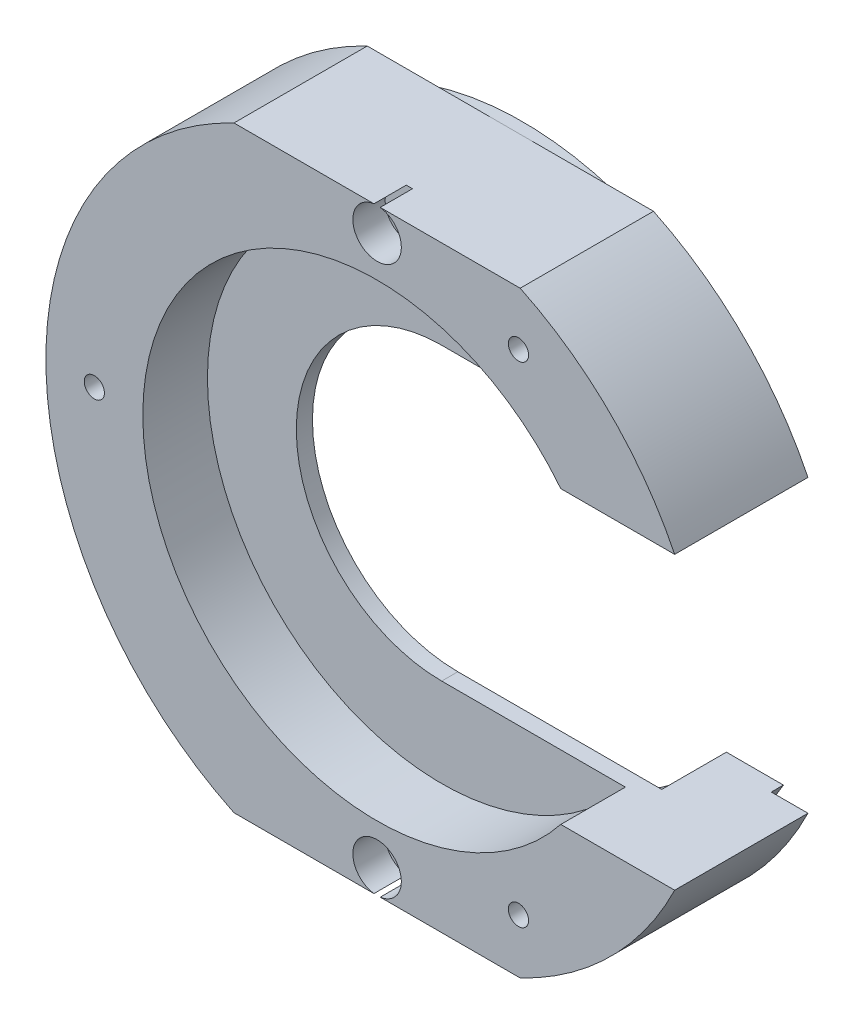
ISO-10303-21;
HEADER;
FILE_DESCRIPTION(('STEP AP214'),'2;1');
FILE_NAME('part.step','',(''),(''),'','','');
FILE_SCHEMA(('AUTOMOTIVE_DESIGN { 1 0 10303 214 1 1 1 1 }'));
ENDSEC;
DATA;
#1=APPLICATION_CONTEXT('core data for automotive mechanical design processes');
#2=APPLICATION_PROTOCOL_DEFINITION('international standard','automotive_design',2000,#1);
#3=PRODUCT_CONTEXT('',#1,'mechanical');
#4=PRODUCT('Part','Part','',(#3));
#5=PRODUCT_RELATED_PRODUCT_CATEGORY('part','',(#4));
#6=PRODUCT_DEFINITION_FORMATION('','',#4);
#7=PRODUCT_DEFINITION_CONTEXT('part definition',#1,'design');
#8=PRODUCT_DEFINITION('design','',#6,#7);
#9=PRODUCT_DEFINITION_SHAPE('','',#8);
#10=(LENGTH_UNIT() NAMED_UNIT(*) SI_UNIT(.MILLI.,.METRE.));
#11=(NAMED_UNIT(*) PLANE_ANGLE_UNIT() SI_UNIT($,.RADIAN.));
#12=(NAMED_UNIT(*) SI_UNIT($,.STERADIAN.) SOLID_ANGLE_UNIT());
#13=UNCERTAINTY_MEASURE_WITH_UNIT(LENGTH_MEASURE(1.E-05),#10,'distance_accuracy_value','');
#14=(GEOMETRIC_REPRESENTATION_CONTEXT(3) GLOBAL_UNCERTAINTY_ASSIGNED_CONTEXT((#13)) GLOBAL_UNIT_ASSIGNED_CONTEXT((#10,
#11,#12)) REPRESENTATION_CONTEXT('',''));
#15=CARTESIAN_POINT('',(0.,0.,0.));
#16=DIRECTION('',(0.,0.,1.));
#17=DIRECTION('',(1.,0.,0.));
#18=AXIS2_PLACEMENT_3D('',#15,#16,#17);
#19=CARTESIAN_POINT('',(0.,0.,-1.5));
#20=DIRECTION('',(0.,0.,-1.));
#21=DIRECTION('',(-1.,0.,0.));
#22=AXIS2_PLACEMENT_3D('',#19,#20,#21);
#23=PLANE('',#22);
#24=CARTESIAN_POINT('',(17.5000000000001,-30.3108891324553,-1.5));
#25=DIRECTION('',(0.,0.,1.));
#26=DIRECTION('',(1.,0.,0.));
#27=AXIS2_PLACEMENT_3D('',#24,#25,#26);
#28=CIRCLE('',#27,1.25);
#29=CARTESIAN_POINT('',(18.7500000000001,-30.3108891324553,-1.5));
#30=VERTEX_POINT('',#29);
#31=EDGE_CURVE('E336',#30,#30,#28,.T.);
#32=ORIENTED_EDGE('',*,*,#31,.T.);
#33=EDGE_LOOP('',(#32));
#34=FACE_BOUND('',#33,.T.);
#35=CARTESIAN_POINT('',(0.,34.,-1.5));
#36=DIRECTION('',(0.,0.,1.));
#37=DIRECTION('',(1.,0.,0.));
#38=AXIS2_PLACEMENT_3D('',#35,#36,#37);
#39=CIRCLE('',#38,1.74999999999999);
#40=CARTESIAN_POINT('',(1.74999999999999,34.,-1.5));
#41=VERTEX_POINT('',#40);
#42=EDGE_CURVE('E324',#41,#41,#39,.T.);
#43=ORIENTED_EDGE('',*,*,#42,.T.);
#44=EDGE_LOOP('',(#43));
#45=FACE_BOUND('',#44,.T.);
#46=CARTESIAN_POINT('',(0.,-34.,-1.5));
#47=DIRECTION('',(0.,0.,1.));
#48=DIRECTION('',(1.,0.,0.));
#49=AXIS2_PLACEMENT_3D('',#46,#47,#48);
#50=CIRCLE('',#49,1.74999999999999);
#51=CARTESIAN_POINT('',(1.75,-34.,-1.5));
#52=VERTEX_POINT('',#51);
#53=EDGE_CURVE('E315',#52,#52,#50,.T.);
#54=ORIENTED_EDGE('',*,*,#53,.T.);
#55=EDGE_LOOP('',(#54));
#56=FACE_BOUND('',#55,.T.);
#57=DIRECTION('',(-1.,0.,0.));
#58=VECTOR('',#57,1.);
#59=CARTESIAN_POINT('',(0.,18.,-1.5));
#60=LINE('',#59,#58);
#61=CARTESIAN_POINT('',(32.2978424201989,18.,-1.5));
#62=VERTEX_POINT('',#61);
#63=CARTESIAN_POINT('',(25.2388589282479,18.,-1.5));
#64=VERTEX_POINT('',#63);
#65=EDGE_CURVE('E299',#62,#64,#60,.T.);
#66=ORIENTED_EDGE('',*,*,#65,.T.);
#67=CARTESIAN_POINT('',(0.,0.,-1.5));
#68=DIRECTION('',(0.,0.,-1.));
#69=DIRECTION('',(-1.,0.,0.));
#70=AXIS2_PLACEMENT_3D('',#67,#68,#69);
#71=CIRCLE('',#70,31.);
#72=CARTESIAN_POINT('',(25.2388589282479,-18.,-1.5));
#73=VERTEX_POINT('',#72);
#74=EDGE_CURVE('E253',#73,#64,#71,.T.);
#75=ORIENTED_EDGE('',*,*,#74,.F.);
#76=DIRECTION('',(1.,0.,0.));
#77=VECTOR('',#76,1.);
#78=CARTESIAN_POINT('',(0.,-18.,-1.5));
#79=LINE('',#78,#77);
#80=CARTESIAN_POINT('',(32.2978424201989,-18.,-1.5));
#81=VERTEX_POINT('',#80);
#82=EDGE_CURVE('E308',#73,#81,#79,.T.);
#83=ORIENTED_EDGE('',*,*,#82,.T.);
#84=CARTESIAN_POINT('',(0.,0.,-1.5));
#85=DIRECTION('',(0.,0.,-1.));
#86=DIRECTION('',(-1.,0.,0.));
#87=AXIS2_PLACEMENT_3D('',#84,#85,#86);
#88=CIRCLE('',#87,36.975);
#89=EDGE_CURVE('E223',#81,#62,#88,.T.);
#90=ORIENTED_EDGE('',*,*,#89,.T.);
#91=EDGE_LOOP('',(#66,#75,#83,#90));
#92=FACE_BOUND('',#91,.T.);
#93=CARTESIAN_POINT('',(-35.,0.,-1.5));
#94=DIRECTION('',(0.,0.,1.));
#95=DIRECTION('',(1.,0.,0.));
#96=AXIS2_PLACEMENT_3D('',#93,#94,#95);
#97=CIRCLE('',#96,1.24999999999999);
#98=CARTESIAN_POINT('',(-33.75,0.,-1.5));
#99=VERTEX_POINT('',#98);
#100=EDGE_CURVE('E330',#99,#99,#97,.T.);
#101=ORIENTED_EDGE('',*,*,#100,.T.);
#102=EDGE_LOOP('',(#101));
#103=FACE_BOUND('',#102,.T.);
#104=CARTESIAN_POINT('',(17.4999999999997,30.3108891324555,-1.5));
#105=DIRECTION('',(0.,0.,1.));
#106=DIRECTION('',(1.,0.,0.));
#107=AXIS2_PLACEMENT_3D('',#104,#105,#106);
#108=CIRCLE('',#107,1.25);
#109=CARTESIAN_POINT('',(18.7499999999997,30.3108891324555,-1.5));
#110=VERTEX_POINT('',#109);
#111=EDGE_CURVE('E342',#110,#110,#108,.T.);
#112=ORIENTED_EDGE('',*,*,#111,.T.);
#113=EDGE_LOOP('',(#112));
#114=FACE_BOUND('',#113,.T.);
#115=ADVANCED_FACE('F47',(#34,#45,#56,#92,#103,#114),#23,.T.);
#116=CARTESIAN_POINT('',(0.,0.,16.5));
#117=DIRECTION('',(0.,0.,-1.));
#118=DIRECTION('',(-1.,0.,0.));
#119=AXIS2_PLACEMENT_3D('',#116,#117,#118);
#120=CYLINDRICAL_SURFACE('',#119,41.);
#121=CARTESIAN_POINT('',(0.,0.,16.5));
#122=DIRECTION('',(0.,0.,1.));
#123=DIRECTION('',(1.,0.,0.));
#124=AXIS2_PLACEMENT_3D('',#121,#122,#123);
#125=CIRCLE('',#124,41.);
#126=CARTESIAN_POINT('',(36.8374809127877,18.,16.5));
#127=VERTEX_POINT('',#126);
#128=CARTESIAN_POINT('',(17.7157945065978,36.975,16.5));
#129=VERTEX_POINT('',#128);
#130=EDGE_CURVE('E218',#127,#129,#125,.T.);
#131=ORIENTED_EDGE('',*,*,#130,.F.);
#132=DIRECTION('',(0.,0.,1.));
#133=VECTOR('',#132,1.);
#134=CARTESIAN_POINT('',(36.8374809127877,18.,-1.5));
#135=LINE('',#134,#133);
#136=CARTESIAN_POINT('',(36.8374809127877,18.,0.));
#137=VERTEX_POINT('',#136);
#138=EDGE_CURVE('E302',#137,#127,#135,.T.);
#139=ORIENTED_EDGE('',*,*,#138,.F.);
#140=CARTESIAN_POINT('',(0.,0.,0.));
#141=DIRECTION('',(0.,0.,1.));
#142=DIRECTION('',(1.,0.,0.));
#143=AXIS2_PLACEMENT_3D('',#140,#141,#142);
#144=CIRCLE('',#143,41.);
#145=CARTESIAN_POINT('',(17.7157945065978,36.975,0.));
#146=VERTEX_POINT('',#145);
#147=EDGE_CURVE('E213',#137,#146,#144,.T.);
#148=ORIENTED_EDGE('',*,*,#147,.T.);
#149=DIRECTION('',(0.,0.,-1.));
#150=VECTOR('',#149,1.);
#151=CARTESIAN_POINT('',(17.7157945065978,36.975,16.5));
#152=LINE('',#151,#150);
#153=EDGE_CURVE('E230',#146,#129,#152,.F.);
#154=ORIENTED_EDGE('',*,*,#153,.T.);
#155=EDGE_LOOP('',(#131,#139,#148,#154));
#156=FACE_BOUND('',#155,.T.);
#157=ADVANCED_FACE('F375',(#156),#120,.T.);
#158=CARTESIAN_POINT('',(0.,0.,0.));
#159=DIRECTION('',(0.,0.,1.));
#160=DIRECTION('',(1.,0.,0.));
#161=AXIS2_PLACEMENT_3D('',#158,#159,#160);
#162=PLANE('',#161);
#163=ORIENTED_EDGE('',*,*,#147,.F.);
#164=DIRECTION('',(-1.,0.,0.));
#165=VECTOR('',#164,1.);
#166=CARTESIAN_POINT('',(0.,18.,0.));
#167=LINE('',#166,#165);
#168=CARTESIAN_POINT('',(32.2978424201989,18.,0.));
#169=VERTEX_POINT('',#168);
#170=EDGE_CURVE('E267',#137,#169,#167,.T.);
#171=ORIENTED_EDGE('',*,*,#170,.T.);
#172=CARTESIAN_POINT('',(0.,0.,0.));
#173=DIRECTION('',(0.,0.,-1.));
#174=DIRECTION('',(-1.,0.,0.));
#175=AXIS2_PLACEMENT_3D('',#172,#173,#174);
#176=CIRCLE('',#175,36.975);
#177=CARTESIAN_POINT('',(0.,36.975,0.));
#178=VERTEX_POINT('',#177);
#179=EDGE_CURVE('E208',#178,#169,#176,.T.);
#180=ORIENTED_EDGE('',*,*,#179,.F.);
#181=DIRECTION('',(1.,0.,0.));
#182=VECTOR('',#181,1.);
#183=CARTESIAN_POINT('',(0.,36.975,0.));
#184=LINE('',#183,#182);
#185=EDGE_CURVE('E233',#178,#146,#184,.T.);
#186=ORIENTED_EDGE('',*,*,#185,.T.);
#187=EDGE_LOOP('',(#163,#171,#180,#186));
#188=FACE_BOUND('',#187,.T.);
#189=ADVANCED_FACE('F378',(#188),#162,.F.);
#190=CARTESIAN_POINT('',(-17.7157945065978,36.975,16.5));
#191=VERTEX_POINT('',#190);
#192=CARTESIAN_POINT('',(-17.7157945065978,-36.975,16.5));
#193=VERTEX_POINT('',#192);
#194=EDGE_CURVE('E217',#191,#193,#125,.T.);
#195=ORIENTED_EDGE('',*,*,#194,.F.);
#196=DIRECTION('',(0.,0.,-1.));
#197=VECTOR('',#196,1.);
#198=CARTESIAN_POINT('',(-17.7157945065978,36.975,16.5));
#199=LINE('',#198,#197);
#200=CARTESIAN_POINT('',(-17.7157945065978,36.975,0.));
#201=VERTEX_POINT('',#200);
#202=EDGE_CURVE('E226',#191,#201,#199,.T.);
#203=ORIENTED_EDGE('',*,*,#202,.T.);
#204=CARTESIAN_POINT('',(-17.7157945065978,-36.975,0.));
#205=VERTEX_POINT('',#204);
#206=EDGE_CURVE('E212',#201,#205,#144,.T.);
#207=ORIENTED_EDGE('',*,*,#206,.T.);
#208=DIRECTION('',(0.,0.,-1.));
#209=VECTOR('',#208,1.);
#210=CARTESIAN_POINT('',(-17.7157945065978,-36.975,16.5));
#211=LINE('',#210,#209);
#212=EDGE_CURVE('E240',#205,#193,#211,.F.);
#213=ORIENTED_EDGE('',*,*,#212,.T.);
#214=EDGE_LOOP('',(#195,#203,#207,#213));
#215=FACE_BOUND('',#214,.T.);
#216=ADVANCED_FACE('F367',(#215),#120,.T.);
#217=ORIENTED_EDGE('',*,*,#206,.F.);
#218=EDGE_CURVE('E229',#201,#178,#184,.T.);
#219=ORIENTED_EDGE('',*,*,#218,.T.);
#220=CARTESIAN_POINT('',(0.,-36.975,0.));
#221=VERTEX_POINT('',#220);
#222=EDGE_CURVE('E222',#221,#178,#176,.T.);
#223=ORIENTED_EDGE('',*,*,#222,.F.);
#224=DIRECTION('',(-1.,0.,0.));
#225=VECTOR('',#224,1.);
#226=CARTESIAN_POINT('',(0.,-36.975,0.));
#227=LINE('',#226,#225);
#228=EDGE_CURVE('E243',#221,#205,#227,.T.);
#229=ORIENTED_EDGE('',*,*,#228,.T.);
#230=EDGE_LOOP('',(#217,#219,#223,#229));
#231=FACE_BOUND('',#230,.T.);
#232=ADVANCED_FACE('F386',(#231),#162,.F.);
#233=CARTESIAN_POINT('',(17.7157945065978,-36.975,0.));
#234=VERTEX_POINT('',#233);
#235=CARTESIAN_POINT('',(36.8374809127877,-18.,0.));
#236=VERTEX_POINT('',#235);
#237=EDGE_CURVE('E209',#234,#236,#144,.T.);
#238=ORIENTED_EDGE('',*,*,#237,.T.);
#239=DIRECTION('',(0.,0.,1.));
#240=VECTOR('',#239,1.);
#241=CARTESIAN_POINT('',(36.8374809127877,-18.,-1.5));
#242=LINE('',#241,#240);
#243=CARTESIAN_POINT('',(36.8374809127877,-18.,16.5));
#244=VERTEX_POINT('',#243);
#245=EDGE_CURVE('E298',#236,#244,#242,.T.);
#246=ORIENTED_EDGE('',*,*,#245,.T.);
#247=CARTESIAN_POINT('',(17.7157945065978,-36.975,16.5));
#248=VERTEX_POINT('',#247);
#249=EDGE_CURVE('E214',#248,#244,#125,.T.);
#250=ORIENTED_EDGE('',*,*,#249,.F.);
#251=DIRECTION('',(0.,0.,-1.));
#252=VECTOR('',#251,1.);
#253=CARTESIAN_POINT('',(17.7157945065978,-36.975,16.5));
#254=LINE('',#253,#252);
#255=EDGE_CURVE('E236',#248,#234,#254,.T.);
#256=ORIENTED_EDGE('',*,*,#255,.T.);
#257=EDGE_LOOP('',(#238,#246,#250,#256));
#258=FACE_BOUND('',#257,.T.);
#259=ADVANCED_FACE('F49',(#258),#120,.T.);
#260=CARTESIAN_POINT('',(0.,0.,16.5));
#261=DIRECTION('',(0.,0.,1.));
#262=DIRECTION('',(1.,0.,0.));
#263=AXIS2_PLACEMENT_3D('',#260,#261,#262);
#264=PLANE('',#263);
#265=CARTESIAN_POINT('',(17.4999999999997,30.3108891324555,16.5));
#266=DIRECTION('',(0.,0.,1.));
#267=DIRECTION('',(1.,0.,0.));
#268=AXIS2_PLACEMENT_3D('',#265,#266,#267);
#269=CIRCLE('',#268,1.24999999999999);
#270=CARTESIAN_POINT('',(18.7499999999997,30.3108891324555,16.5));
#271=VERTEX_POINT('',#270);
#272=EDGE_CURVE('E345',#271,#271,#269,.T.);
#273=ORIENTED_EDGE('',*,*,#272,.F.);
#274=EDGE_LOOP('',(#273));
#275=FACE_BOUND('',#274,.T.);
#276=CARTESIAN_POINT('',(17.5000000000001,-30.3108891324553,16.5));
#277=DIRECTION('',(0.,0.,1.));
#278=DIRECTION('',(1.,0.,0.));
#279=AXIS2_PLACEMENT_3D('',#276,#277,#278);
#280=CIRCLE('',#279,1.24999999999999);
#281=CARTESIAN_POINT('',(18.7500000000001,-30.3108891324553,16.5));
#282=VERTEX_POINT('',#281);
#283=EDGE_CURVE('E339',#282,#282,#280,.T.);
#284=ORIENTED_EDGE('',*,*,#283,.F.);
#285=EDGE_LOOP('',(#284));
#286=FACE_BOUND('',#285,.T.);
#287=CARTESIAN_POINT('',(-35.,0.,16.5));
#288=DIRECTION('',(0.,0.,1.));
#289=DIRECTION('',(1.,0.,0.));
#290=AXIS2_PLACEMENT_3D('',#287,#288,#289);
#291=CIRCLE('',#290,1.24999999999999);
#292=CARTESIAN_POINT('',(-33.75,0.,16.5));
#293=VERTEX_POINT('',#292);
#294=EDGE_CURVE('E333',#293,#293,#291,.T.);
#295=ORIENTED_EDGE('',*,*,#294,.F.);
#296=EDGE_LOOP('',(#295));
#297=FACE_BOUND('',#296,.T.);
#298=CARTESIAN_POINT('',(0.,34.,16.5));
#299=DIRECTION('',(0.,0.,1.));
#300=DIRECTION('',(1.,0.,0.));
#301=AXIS2_PLACEMENT_3D('',#298,#299,#300);
#302=CIRCLE('',#301,3.);
#303=CARTESIAN_POINT('',(-0.386490620843434,36.975,16.5));
#304=VERTEX_POINT('',#303);
#305=CARTESIAN_POINT('',(0.386490620843434,36.975,16.5));
#306=VERTEX_POINT('',#305);
#307=EDGE_CURVE('E177',#304,#306,#302,.T.);
#308=ORIENTED_EDGE('',*,*,#307,.F.);
#309=DIRECTION('',(-1.,0.,0.));
#310=VECTOR('',#309,1.);
#311=CARTESIAN_POINT('',(25.,36.975,16.5));
#312=LINE('',#311,#310);
#313=EDGE_CURVE('E250',#304,#191,#312,.T.);
#314=ORIENTED_EDGE('',*,*,#313,.T.);
#315=ORIENTED_EDGE('',*,*,#194,.T.);
#316=DIRECTION('',(1.,0.,0.));
#317=VECTOR('',#316,1.);
#318=CARTESIAN_POINT('',(25.,-36.975,16.5));
#319=LINE('',#318,#317);
#320=CARTESIAN_POINT('',(-0.386490620843426,-36.975,16.5));
#321=VERTEX_POINT('',#320);
#322=EDGE_CURVE('E247',#193,#321,#319,.T.);
#323=ORIENTED_EDGE('',*,*,#322,.T.);
#324=CARTESIAN_POINT('',(0.,-34.,16.5));
#325=DIRECTION('',(0.,0.,1.));
#326=DIRECTION('',(1.,0.,0.));
#327=AXIS2_PLACEMENT_3D('',#324,#325,#326);
#328=CIRCLE('',#327,3.);
#329=CARTESIAN_POINT('',(0.386490620843442,-36.975,16.5));
#330=VERTEX_POINT('',#329);
#331=EDGE_CURVE('E322',#330,#321,#328,.T.);
#332=ORIENTED_EDGE('',*,*,#331,.F.);
#333=EDGE_CURVE('E251',#330,#248,#319,.T.);
#334=ORIENTED_EDGE('',*,*,#333,.T.);
#335=ORIENTED_EDGE('',*,*,#249,.T.);
#336=DIRECTION('',(1.,0.,0.));
#337=VECTOR('',#336,1.);
#338=CARTESIAN_POINT('',(0.,-18.,16.5));
#339=LINE('',#338,#337);
#340=CARTESIAN_POINT('',(22.7376340018041,-18.,16.5));
#341=VERTEX_POINT('',#340);
#342=EDGE_CURVE('E313',#341,#244,#339,.T.);
#343=ORIENTED_EDGE('',*,*,#342,.F.);
#344=CARTESIAN_POINT('',(0.,0.,16.5));
#345=DIRECTION('',(0.,0.,1.));
#346=DIRECTION('',(1.,0.,0.));
#347=AXIS2_PLACEMENT_3D('',#344,#345,#346);
#348=CIRCLE('',#347,29.);
#349=CARTESIAN_POINT('',(22.7376340018041,18.,16.5));
#350=VERTEX_POINT('',#349);
#351=EDGE_CURVE('E260',#350,#341,#348,.T.);
#352=ORIENTED_EDGE('',*,*,#351,.F.);
#353=DIRECTION('',(-1.,0.,0.));
#354=VECTOR('',#353,1.);
#355=CARTESIAN_POINT('',(0.,18.,16.5));
#356=LINE('',#355,#354);
#357=EDGE_CURVE('E311',#127,#350,#356,.T.);
#358=ORIENTED_EDGE('',*,*,#357,.F.);
#359=ORIENTED_EDGE('',*,*,#130,.T.);
#360=EDGE_CURVE('E246',#129,#306,#312,.T.);
#361=ORIENTED_EDGE('',*,*,#360,.T.);
#362=EDGE_LOOP('',(#308,#314,#315,#323,#332,#334,#335,#343,#352,#358,#359,#361));
#363=FACE_BOUND('',#362,.T.);
#364=ADVANCED_FACE('F351',(#275,#286,#297,#363),#264,.T.);
#365=CARTESIAN_POINT('',(32.2978424201989,-18.,0.));
#366=VERTEX_POINT('',#365);
#367=EDGE_CURVE('E221',#366,#221,#176,.T.);
#368=ORIENTED_EDGE('',*,*,#367,.F.);
#369=DIRECTION('',(1.,0.,0.));
#370=VECTOR('',#369,1.);
#371=CARTESIAN_POINT('',(0.,-18.,0.));
#372=LINE('',#371,#370);
#373=EDGE_CURVE('E281',#366,#236,#372,.T.);
#374=ORIENTED_EDGE('',*,*,#373,.T.);
#375=ORIENTED_EDGE('',*,*,#237,.F.);
#376=EDGE_CURVE('E239',#234,#221,#227,.T.);
#377=ORIENTED_EDGE('',*,*,#376,.T.);
#378=EDGE_LOOP('',(#368,#374,#375,#377));
#379=FACE_BOUND('',#378,.T.);
#380=ADVANCED_FACE('F354',(#379),#162,.F.);
#381=CARTESIAN_POINT('',(0.,0.,-1.5));
#382=DIRECTION('',(0.,0.,1.));
#383=DIRECTION('',(1.,0.,0.));
#384=AXIS2_PLACEMENT_3D('',#381,#382,#383);
#385=CYLINDRICAL_SURFACE('',#384,36.975);
#386=ORIENTED_EDGE('',*,*,#179,.T.);
#387=DIRECTION('',(0.,0.,1.));
#388=VECTOR('',#387,1.);
#389=CARTESIAN_POINT('',(32.2978424201989,18.,-1.5));
#390=LINE('',#389,#388);
#391=EDGE_CURVE('E270',#169,#62,#390,.F.);
#392=ORIENTED_EDGE('',*,*,#391,.T.);
#393=ORIENTED_EDGE('',*,*,#89,.F.);
#394=DIRECTION('',(0.,0.,1.));
#395=VECTOR('',#394,1.);
#396=CARTESIAN_POINT('',(32.2978424201989,-18.,-1.5));
#397=LINE('',#396,#395);
#398=EDGE_CURVE('E284',#81,#366,#397,.T.);
#399=ORIENTED_EDGE('',*,*,#398,.T.);
#400=ORIENTED_EDGE('',*,*,#367,.T.);
#401=ORIENTED_EDGE('',*,*,#222,.T.);
#402=EDGE_LOOP('',(#386,#392,#393,#399,#400,#401));
#403=FACE_BOUND('',#402,.T.);
#404=ADVANCED_FACE('F380',(#403),#385,.T.);
#405=CARTESIAN_POINT('',(25.,-36.975,16.5));
#406=DIRECTION('',(0.,1.,0.));
#407=DIRECTION('',(0.,0.,1.));
#408=AXIS2_PLACEMENT_3D('',#405,#406,#407);
#409=PLANE('',#408);
#410=DIRECTION('',(-1.,0.,0.));
#411=VECTOR('',#410,1.);
#412=CARTESIAN_POINT('',(25.,-36.975,12.5));
#413=LINE('',#412,#411);
#414=CARTESIAN_POINT('',(0.386490620843442,-36.975,12.5));
#415=VERTEX_POINT('',#414);
#416=CARTESIAN_POINT('',(-0.386490620843426,-36.975,12.5));
#417=VERTEX_POINT('',#416);
#418=EDGE_CURVE('E198',#415,#417,#413,.T.);
#419=ORIENTED_EDGE('',*,*,#418,.T.);
#420=DIRECTION('',(0.,0.,1.));
#421=VECTOR('',#420,1.);
#422=CARTESIAN_POINT('',(-0.386490620843426,-36.975,16.5));
#423=LINE('',#422,#421);
#424=EDGE_CURVE('E190',#417,#321,#423,.T.);
#425=ORIENTED_EDGE('',*,*,#424,.T.);
#426=ORIENTED_EDGE('',*,*,#322,.F.);
#427=ORIENTED_EDGE('',*,*,#212,.F.);
#428=ORIENTED_EDGE('',*,*,#228,.F.);
#429=ORIENTED_EDGE('',*,*,#376,.F.);
#430=ORIENTED_EDGE('',*,*,#255,.F.);
#431=ORIENTED_EDGE('',*,*,#333,.F.);
#432=DIRECTION('',(0.,0.,1.));
#433=VECTOR('',#432,1.);
#434=CARTESIAN_POINT('',(0.386490620843442,-36.975,16.5));
#435=LINE('',#434,#433);
#436=EDGE_CURVE('E195',#330,#415,#435,.F.);
#437=ORIENTED_EDGE('',*,*,#436,.T.);
#438=EDGE_LOOP('',(#419,#425,#426,#427,#428,#429,#430,#431,#437));
#439=FACE_BOUND('',#438,.T.);
#440=ADVANCED_FACE('F389',(#439),#409,.F.);
#441=CARTESIAN_POINT('',(25.,36.975,16.5));
#442=DIRECTION('',(0.,-1.,0.));
#443=DIRECTION('',(0.,0.,-1.));
#444=AXIS2_PLACEMENT_3D('',#441,#442,#443);
#445=PLANE('',#444);
#446=DIRECTION('',(1.,0.,0.));
#447=VECTOR('',#446,1.);
#448=CARTESIAN_POINT('',(25.,36.975,12.5));
#449=LINE('',#448,#447);
#450=CARTESIAN_POINT('',(-0.386490620843434,36.975,12.5));
#451=VERTEX_POINT('',#450);
#452=CARTESIAN_POINT('',(0.386490620843434,36.975,12.5));
#453=VERTEX_POINT('',#452);
#454=EDGE_CURVE('E55',#451,#453,#449,.T.);
#455=ORIENTED_EDGE('',*,*,#454,.T.);
#456=DIRECTION('',(0.,0.,1.));
#457=VECTOR('',#456,1.);
#458=CARTESIAN_POINT('',(0.386490620843434,36.975,16.5));
#459=LINE('',#458,#457);
#460=EDGE_CURVE('E11',#453,#306,#459,.T.);
#461=ORIENTED_EDGE('',*,*,#460,.T.);
#462=ORIENTED_EDGE('',*,*,#360,.F.);
#463=ORIENTED_EDGE('',*,*,#153,.F.);
#464=ORIENTED_EDGE('',*,*,#185,.F.);
#465=ORIENTED_EDGE('',*,*,#218,.F.);
#466=ORIENTED_EDGE('',*,*,#202,.F.);
#467=ORIENTED_EDGE('',*,*,#313,.F.);
#468=DIRECTION('',(0.,0.,1.));
#469=VECTOR('',#468,1.);
#470=CARTESIAN_POINT('',(-0.386490620843434,36.975,16.5));
#471=LINE('',#470,#469);
#472=EDGE_CURVE('E189',#304,#451,#471,.F.);
#473=ORIENTED_EDGE('',*,*,#472,.T.);
#474=EDGE_LOOP('',(#455,#461,#462,#463,#464,#465,#466,#467,#473));
#475=FACE_BOUND('',#474,.T.);
#476=ADVANCED_FACE('F187',(#475),#445,.F.);
#477=CARTESIAN_POINT('',(0.,0.,6.5));
#478=DIRECTION('',(0.,0.,-1.));
#479=DIRECTION('',(-1.,0.,0.));
#480=AXIS2_PLACEMENT_3D('',#477,#478,#479);
#481=CYLINDRICAL_SURFACE('',#480,31.);
#482=ORIENTED_EDGE('',*,*,#74,.T.);
#483=DIRECTION('',(0.,0.,-1.));
#484=VECTOR('',#483,1.);
#485=CARTESIAN_POINT('',(25.2388589282479,18.,6.5));
#486=LINE('',#485,#484);
#487=CARTESIAN_POINT('',(25.2388589282479,18.,6.5));
#488=VERTEX_POINT('',#487);
#489=EDGE_CURVE('E273',#64,#488,#486,.F.);
#490=ORIENTED_EDGE('',*,*,#489,.T.);
#491=CARTESIAN_POINT('',(0.,0.,6.5));
#492=DIRECTION('',(0.,0.,-1.));
#493=DIRECTION('',(-1.,0.,0.));
#494=AXIS2_PLACEMENT_3D('',#491,#492,#493);
#495=CIRCLE('',#494,31.);
#496=CARTESIAN_POINT('',(25.2388589282479,-18.,6.5));
#497=VERTEX_POINT('',#496);
#498=EDGE_CURVE('E256',#497,#488,#495,.T.);
#499=ORIENTED_EDGE('',*,*,#498,.F.);
#500=DIRECTION('',(0.,0.,-1.));
#501=VECTOR('',#500,1.);
#502=CARTESIAN_POINT('',(25.2388589282479,-18.,6.5));
#503=LINE('',#502,#501);
#504=EDGE_CURVE('E287',#497,#73,#503,.T.);
#505=ORIENTED_EDGE('',*,*,#504,.T.);
#506=EDGE_LOOP('',(#482,#490,#499,#505));
#507=FACE_BOUND('',#506,.T.);
#508=ADVANCED_FACE('F455',(#507),#481,.F.);
#509=CARTESIAN_POINT('',(0.,0.,6.5));
#510=DIRECTION('',(0.,0.,-1.));
#511=DIRECTION('',(-1.,0.,0.));
#512=AXIS2_PLACEMENT_3D('',#509,#510,#511);
#513=PLANE('',#512);
#514=DIRECTION('',(1.,0.,0.));
#515=VECTOR('',#514,1.);
#516=CARTESIAN_POINT('',(0.,18.,6.5));
#517=LINE('',#516,#515);
#518=CARTESIAN_POINT('',(0.,18.,6.5));
#519=VERTEX_POINT('',#518);
#520=EDGE_CURVE('E276',#519,#488,#517,.T.);
#521=ORIENTED_EDGE('',*,*,#520,.F.);
#522=CARTESIAN_POINT('',(0.,0.,6.5));
#523=DIRECTION('',(0.,0.,-1.));
#524=DIRECTION('',(-1.,0.,0.));
#525=AXIS2_PLACEMENT_3D('',#522,#523,#524);
#526=CIRCLE('',#525,18.);
#527=CARTESIAN_POINT('',(0.,-18.,6.5));
#528=VERTEX_POINT('',#527);
#529=EDGE_CURVE('E263',#528,#519,#526,.T.);
#530=ORIENTED_EDGE('',*,*,#529,.F.);
#531=DIRECTION('',(-1.,0.,0.));
#532=VECTOR('',#531,1.);
#533=CARTESIAN_POINT('',(0.,-18.,6.5));
#534=LINE('',#533,#532);
#535=EDGE_CURVE('E290',#497,#528,#534,.T.);
#536=ORIENTED_EDGE('',*,*,#535,.F.);
#537=ORIENTED_EDGE('',*,*,#498,.T.);
#538=EDGE_LOOP('',(#521,#530,#536,#537));
#539=FACE_BOUND('',#538,.T.);
#540=ADVANCED_FACE('F462',(#539),#513,.T.);
#541=CARTESIAN_POINT('',(0.,0.,8.5));
#542=DIRECTION('',(0.,0.,1.));
#543=DIRECTION('',(1.,0.,0.));
#544=AXIS2_PLACEMENT_3D('',#541,#542,#543);
#545=CYLINDRICAL_SURFACE('',#544,29.);
#546=CARTESIAN_POINT('',(0.,0.,8.5));
#547=DIRECTION('',(0.,0.,1.));
#548=DIRECTION('',(1.,0.,0.));
#549=AXIS2_PLACEMENT_3D('',#546,#547,#548);
#550=CIRCLE('',#549,29.);
#551=CARTESIAN_POINT('',(22.7376340018041,18.,8.5));
#552=VERTEX_POINT('',#551);
#553=CARTESIAN_POINT('',(22.7376340018041,-18.,8.5));
#554=VERTEX_POINT('',#553);
#555=EDGE_CURVE('E257',#552,#554,#550,.T.);
#556=ORIENTED_EDGE('',*,*,#555,.F.);
#557=DIRECTION('',(0.,0.,1.));
#558=VECTOR('',#557,1.);
#559=CARTESIAN_POINT('',(22.7376340018041,18.,8.5));
#560=LINE('',#559,#558);
#561=EDGE_CURVE('E278',#552,#350,#560,.T.);
#562=ORIENTED_EDGE('',*,*,#561,.T.);
#563=ORIENTED_EDGE('',*,*,#351,.T.);
#564=DIRECTION('',(0.,0.,1.));
#565=VECTOR('',#564,1.);
#566=CARTESIAN_POINT('',(22.7376340018041,-18.,8.5));
#567=LINE('',#566,#565);
#568=EDGE_CURVE('E292',#341,#554,#567,.F.);
#569=ORIENTED_EDGE('',*,*,#568,.T.);
#570=EDGE_LOOP('',(#556,#562,#563,#569));
#571=FACE_BOUND('',#570,.T.);
#572=ADVANCED_FACE('F471',(#571),#545,.F.);
#573=CARTESIAN_POINT('',(0.,0.,8.5));
#574=DIRECTION('',(0.,0.,1.));
#575=DIRECTION('',(1.,0.,0.));
#576=AXIS2_PLACEMENT_3D('',#573,#574,#575);
#577=PLANE('',#576);
#578=DIRECTION('',(-1.,0.,0.));
#579=VECTOR('',#578,1.);
#580=CARTESIAN_POINT('',(0.,18.,8.5));
#581=LINE('',#580,#579);
#582=CARTESIAN_POINT('',(0.,18.,8.5));
#583=VERTEX_POINT('',#582);
#584=EDGE_CURVE('E201',#552,#583,#581,.T.);
#585=ORIENTED_EDGE('',*,*,#584,.F.);
#586=ORIENTED_EDGE('',*,*,#555,.T.);
#587=DIRECTION('',(1.,0.,0.));
#588=VECTOR('',#587,1.);
#589=CARTESIAN_POINT('',(0.,-18.,8.5));
#590=LINE('',#589,#588);
#591=CARTESIAN_POINT('',(0.,-18.,8.5));
#592=VERTEX_POINT('',#591);
#593=EDGE_CURVE('E206',#592,#554,#590,.T.);
#594=ORIENTED_EDGE('',*,*,#593,.F.);
#595=CARTESIAN_POINT('',(0.,0.,8.5));
#596=DIRECTION('',(0.,0.,1.));
#597=DIRECTION('',(1.,0.,0.));
#598=AXIS2_PLACEMENT_3D('',#595,#596,#597);
#599=CIRCLE('',#598,18.);
#600=EDGE_CURVE('E203',#583,#592,#599,.T.);
#601=ORIENTED_EDGE('',*,*,#600,.F.);
#602=EDGE_LOOP('',(#585,#586,#594,#601));
#603=FACE_BOUND('',#602,.T.);
#604=ADVANCED_FACE('F480',(#603),#577,.T.);
#605=CARTESIAN_POINT('',(0.,18.,-1.5));
#606=DIRECTION('',(0.,1.,0.));
#607=DIRECTION('',(0.,0.,1.));
#608=AXIS2_PLACEMENT_3D('',#605,#606,#607);
#609=PLANE('',#608);
#610=ORIENTED_EDGE('',*,*,#138,.T.);
#611=ORIENTED_EDGE('',*,*,#357,.T.);
#612=ORIENTED_EDGE('',*,*,#561,.F.);
#613=ORIENTED_EDGE('',*,*,#584,.T.);
#614=DIRECTION('',(0.,0.,1.));
#615=VECTOR('',#614,1.);
#616=CARTESIAN_POINT('',(0.,18.,-1.5));
#617=LINE('',#616,#615);
#618=EDGE_CURVE('E295',#519,#583,#617,.T.);
#619=ORIENTED_EDGE('',*,*,#618,.F.);
#620=ORIENTED_EDGE('',*,*,#520,.T.);
#621=ORIENTED_EDGE('',*,*,#489,.F.);
#622=ORIENTED_EDGE('',*,*,#65,.F.);
#623=ORIENTED_EDGE('',*,*,#391,.F.);
#624=ORIENTED_EDGE('',*,*,#170,.F.);
#625=EDGE_LOOP('',(#610,#611,#612,#613,#619,#620,#621,#622,#623,#624));
#626=FACE_BOUND('',#625,.T.);
#627=ADVANCED_FACE('F489',(#626),#609,.F.);
#628=CARTESIAN_POINT('',(0.,-18.,-1.5));
#629=DIRECTION('',(0.,-1.,0.));
#630=DIRECTION('',(0.,0.,-1.));
#631=AXIS2_PLACEMENT_3D('',#628,#629,#630);
#632=PLANE('',#631);
#633=ORIENTED_EDGE('',*,*,#398,.F.);
#634=ORIENTED_EDGE('',*,*,#82,.F.);
#635=ORIENTED_EDGE('',*,*,#504,.F.);
#636=ORIENTED_EDGE('',*,*,#535,.T.);
#637=DIRECTION('',(0.,0.,1.));
#638=VECTOR('',#637,1.);
#639=CARTESIAN_POINT('',(0.,-18.,-1.5));
#640=LINE('',#639,#638);
#641=EDGE_CURVE('E296',#528,#592,#640,.T.);
#642=ORIENTED_EDGE('',*,*,#641,.T.);
#643=ORIENTED_EDGE('',*,*,#593,.T.);
#644=ORIENTED_EDGE('',*,*,#568,.F.);
#645=ORIENTED_EDGE('',*,*,#342,.T.);
#646=ORIENTED_EDGE('',*,*,#245,.F.);
#647=ORIENTED_EDGE('',*,*,#373,.F.);
#648=EDGE_LOOP('',(#633,#634,#635,#636,#642,#643,#644,#645,#646,#647));
#649=FACE_BOUND('',#648,.T.);
#650=ADVANCED_FACE('F510',(#649),#632,.F.);
#651=CARTESIAN_POINT('',(0.,0.,-1.5));
#652=DIRECTION('',(0.,0.,1.));
#653=DIRECTION('',(1.,0.,0.));
#654=AXIS2_PLACEMENT_3D('',#651,#652,#653);
#655=CYLINDRICAL_SURFACE('',#654,18.);
#656=ORIENTED_EDGE('',*,*,#529,.T.);
#657=ORIENTED_EDGE('',*,*,#618,.T.);
#658=ORIENTED_EDGE('',*,*,#600,.T.);
#659=ORIENTED_EDGE('',*,*,#641,.F.);
#660=EDGE_LOOP('',(#656,#657,#658,#659));
#661=FACE_BOUND('',#660,.T.);
#662=ADVANCED_FACE('F411',(#661),#655,.F.);
#663=CARTESIAN_POINT('',(0.,-34.,16.5));
#664=DIRECTION('',(0.,0.,1.));
#665=DIRECTION('',(1.,0.,0.));
#666=AXIS2_PLACEMENT_3D('',#663,#664,#665);
#667=CYLINDRICAL_SURFACE('',#666,3.);
#668=CARTESIAN_POINT('',(0.,-34.,12.5));
#669=DIRECTION('',(0.,0.,1.));
#670=DIRECTION('',(1.,0.,0.));
#671=AXIS2_PLACEMENT_3D('',#668,#669,#670);
#672=CIRCLE('',#671,3.);
#673=EDGE_CURVE('E69',#415,#417,#672,.T.);
#674=ORIENTED_EDGE('',*,*,#673,.F.);
#675=ORIENTED_EDGE('',*,*,#436,.F.);
#676=ORIENTED_EDGE('',*,*,#331,.T.);
#677=ORIENTED_EDGE('',*,*,#424,.F.);
#678=EDGE_LOOP('',(#674,#675,#676,#677));
#679=FACE_BOUND('',#678,.T.);
#680=ADVANCED_FACE('F399',(#679),#667,.F.);
#681=CARTESIAN_POINT('',(1.75000000000001,-34.,12.5));
#682=DIRECTION('',(0.,0.,-1.));
#683=DIRECTION('',(-1.,0.,0.));
#684=AXIS2_PLACEMENT_3D('',#681,#682,#683);
#685=PLANE('',#684);
#686=CARTESIAN_POINT('',(0.,-34.,12.5));
#687=DIRECTION('',(0.,0.,1.));
#688=DIRECTION('',(1.,0.,0.));
#689=AXIS2_PLACEMENT_3D('',#686,#687,#688);
#690=CIRCLE('',#689,1.75);
#691=CARTESIAN_POINT('',(1.75000000000001,-34.,12.5));
#692=VERTEX_POINT('',#691);
#693=EDGE_CURVE('E318',#692,#692,#690,.T.);
#694=ORIENTED_EDGE('',*,*,#693,.F.);
#695=EDGE_LOOP('',(#694));
#696=FACE_BOUND('',#695,.T.);
#697=ORIENTED_EDGE('',*,*,#673,.T.);
#698=ORIENTED_EDGE('',*,*,#418,.F.);
#699=EDGE_LOOP('',(#697,#698));
#700=FACE_BOUND('',#699,.T.);
#701=ADVANCED_FACE('F400',(#696,#700),#685,.F.);
#702=CARTESIAN_POINT('',(0.,-34.,16.5));
#703=DIRECTION('',(0.,0.,1.));
#704=DIRECTION('',(1.,0.,0.));
#705=AXIS2_PLACEMENT_3D('',#702,#703,#704);
#706=CYLINDRICAL_SURFACE('',#705,1.75);
#707=ORIENTED_EDGE('',*,*,#53,.F.);
#708=EDGE_LOOP('',(#707));
#709=FACE_BOUND('',#708,.T.);
#710=ORIENTED_EDGE('',*,*,#693,.T.);
#711=EDGE_LOOP('',(#710));
#712=FACE_BOUND('',#711,.T.);
#713=ADVANCED_FACE('F402',(#709,#712),#706,.F.);
#714=CARTESIAN_POINT('',(1.75,34.,12.5));
#715=DIRECTION('',(0.,0.,-1.));
#716=DIRECTION('',(-1.,0.,0.));
#717=AXIS2_PLACEMENT_3D('',#714,#715,#716);
#718=PLANE('',#717);
#719=CARTESIAN_POINT('',(0.,34.,12.5));
#720=DIRECTION('',(0.,0.,1.));
#721=DIRECTION('',(1.,0.,0.));
#722=AXIS2_PLACEMENT_3D('',#719,#720,#721);
#723=CIRCLE('',#722,1.75);
#724=CARTESIAN_POINT('',(1.75,34.,12.5));
#725=VERTEX_POINT('',#724);
#726=EDGE_CURVE('E185',#725,#725,#723,.T.);
#727=ORIENTED_EDGE('',*,*,#726,.F.);
#728=EDGE_LOOP('',(#727));
#729=FACE_BOUND('',#728,.T.);
#730=CARTESIAN_POINT('',(0.,34.,12.5));
#731=DIRECTION('',(0.,0.,1.));
#732=DIRECTION('',(1.,0.,0.));
#733=AXIS2_PLACEMENT_3D('',#730,#731,#732);
#734=CIRCLE('',#733,3.);
#735=EDGE_CURVE('E62',#451,#453,#734,.T.);
#736=ORIENTED_EDGE('',*,*,#735,.T.);
#737=ORIENTED_EDGE('',*,*,#454,.F.);
#738=EDGE_LOOP('',(#736,#737));
#739=FACE_BOUND('',#738,.T.);
#740=ADVANCED_FACE('F183',(#729,#739),#718,.F.);
#741=CARTESIAN_POINT('',(0.,34.,16.5));
#742=DIRECTION('',(0.,0.,1.));
#743=DIRECTION('',(1.,0.,0.));
#744=AXIS2_PLACEMENT_3D('',#741,#742,#743);
#745=CYLINDRICAL_SURFACE('',#744,3.);
#746=ORIENTED_EDGE('',*,*,#735,.F.);
#747=ORIENTED_EDGE('',*,*,#472,.F.);
#748=ORIENTED_EDGE('',*,*,#307,.T.);
#749=ORIENTED_EDGE('',*,*,#460,.F.);
#750=EDGE_LOOP('',(#746,#747,#748,#749));
#751=FACE_BOUND('',#750,.T.);
#752=ADVANCED_FACE('F175',(#751),#745,.F.);
#753=CARTESIAN_POINT('',(0.,34.,16.5));
#754=DIRECTION('',(0.,0.,1.));
#755=DIRECTION('',(1.,0.,0.));
#756=AXIS2_PLACEMENT_3D('',#753,#754,#755);
#757=CYLINDRICAL_SURFACE('',#756,1.75);
#758=ORIENTED_EDGE('',*,*,#42,.F.);
#759=EDGE_LOOP('',(#758));
#760=FACE_BOUND('',#759,.T.);
#761=ORIENTED_EDGE('',*,*,#726,.T.);
#762=EDGE_LOOP('',(#761));
#763=FACE_BOUND('',#762,.T.);
#764=ADVANCED_FACE('F557',(#760,#763),#757,.F.);
#765=CARTESIAN_POINT('',(-35.,0.,16.5));
#766=DIRECTION('',(0.,0.,1.));
#767=DIRECTION('',(1.,0.,0.));
#768=AXIS2_PLACEMENT_3D('',#765,#766,#767);
#769=CYLINDRICAL_SURFACE('',#768,1.24999999999999);
#770=ORIENTED_EDGE('',*,*,#100,.F.);
#771=EDGE_LOOP('',(#770));
#772=FACE_BOUND('',#771,.T.);
#773=ORIENTED_EDGE('',*,*,#294,.T.);
#774=EDGE_LOOP('',(#773));
#775=FACE_BOUND('',#774,.T.);
#776=ADVANCED_FACE('F565',(#772,#775),#769,.F.);
#777=CARTESIAN_POINT('',(17.5000000000001,-30.3108891324553,16.5));
#778=DIRECTION('',(0.,0.,1.));
#779=DIRECTION('',(1.,0.,0.));
#780=AXIS2_PLACEMENT_3D('',#777,#778,#779);
#781=CYLINDRICAL_SURFACE('',#780,1.24999999999999);
#782=ORIENTED_EDGE('',*,*,#31,.F.);
#783=EDGE_LOOP('',(#782));
#784=FACE_BOUND('',#783,.T.);
#785=ORIENTED_EDGE('',*,*,#283,.T.);
#786=EDGE_LOOP('',(#785));
#787=FACE_BOUND('',#786,.T.);
#788=ADVANCED_FACE('F574',(#784,#787),#781,.F.);
#789=CARTESIAN_POINT('',(17.4999999999997,30.3108891324555,16.5));
#790=DIRECTION('',(0.,0.,1.));
#791=DIRECTION('',(1.,0.,0.));
#792=AXIS2_PLACEMENT_3D('',#789,#790,#791);
#793=CYLINDRICAL_SURFACE('',#792,1.24999999999999);
#794=ORIENTED_EDGE('',*,*,#111,.F.);
#795=EDGE_LOOP('',(#794));
#796=FACE_BOUND('',#795,.T.);
#797=ORIENTED_EDGE('',*,*,#272,.T.);
#798=EDGE_LOOP('',(#797));
#799=FACE_BOUND('',#798,.T.);
#800=ADVANCED_FACE('F349',(#796,#799),#793,.F.);
#801=CLOSED_SHELL('',(#115,#157,#189,#216,#232,#259,#364,#380,#404,#440,#476,#508,#540,#572,
#604,#627,#650,#662,#680,#701,#713,#740,#752,#764,#776,#788,#800));
#802=MANIFOLD_SOLID_BREP('B2',#801);
#803=ADVANCED_BREP_SHAPE_REPRESENTATION('',(#18,#802),#14);
#804=SHAPE_DEFINITION_REPRESENTATION(#9,#803);
ENDSEC;
END-ISO-10303-21;
